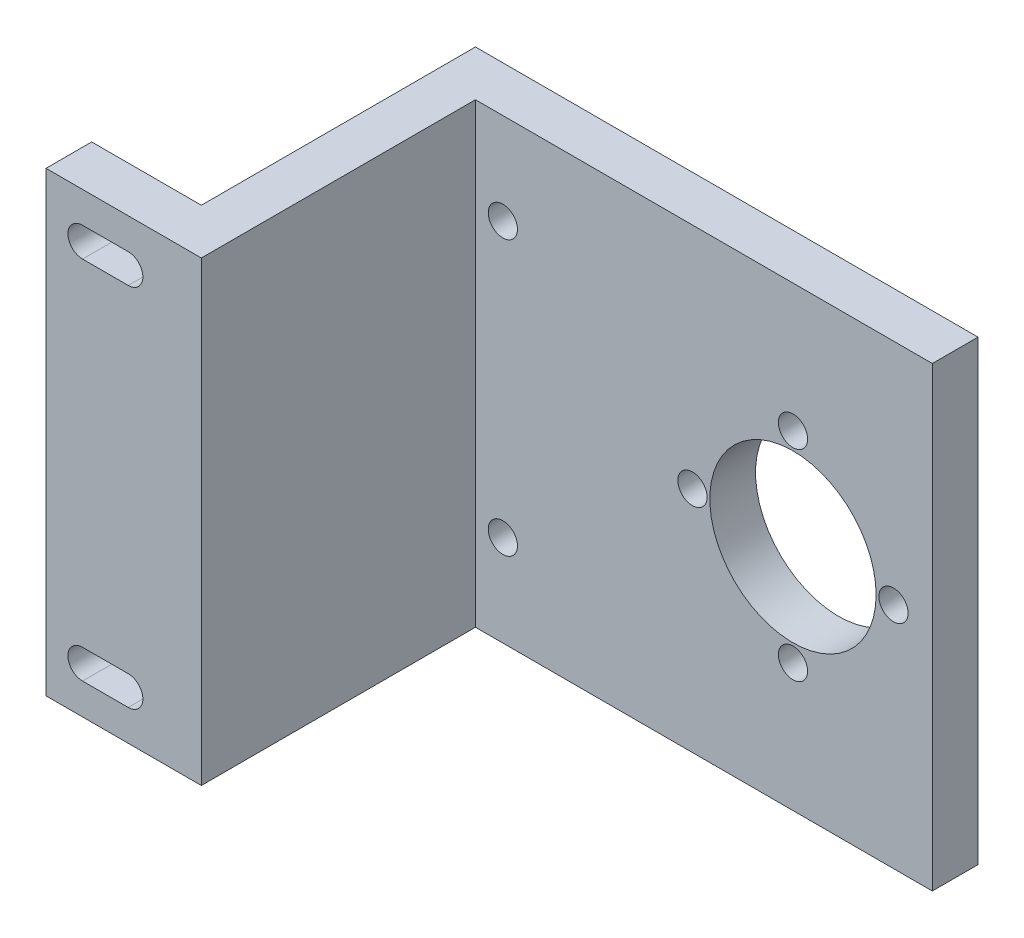
ISO-10303-21;
HEADER;
FILE_DESCRIPTION(('STEP AP214'),'2;1');
FILE_NAME('part.step','',(''),(''),'','','');
FILE_SCHEMA(('AUTOMOTIVE_DESIGN { 1 0 10303 214 1 1 1 1 }'));
ENDSEC;
DATA;
#1=APPLICATION_CONTEXT('core data for automotive mechanical design processes');
#2=APPLICATION_PROTOCOL_DEFINITION('international standard','automotive_design',2000,#1);
#3=PRODUCT_CONTEXT('',#1,'mechanical');
#4=PRODUCT('Part','Part','',(#3));
#5=PRODUCT_RELATED_PRODUCT_CATEGORY('part','',(#4));
#6=PRODUCT_DEFINITION_FORMATION('','',#4);
#7=PRODUCT_DEFINITION_CONTEXT('part definition',#1,'design');
#8=PRODUCT_DEFINITION('design','',#6,#7);
#9=PRODUCT_DEFINITION_SHAPE('','',#8);
#10=(LENGTH_UNIT() NAMED_UNIT(*) SI_UNIT(.MILLI.,.METRE.));
#11=(NAMED_UNIT(*) PLANE_ANGLE_UNIT() SI_UNIT($,.RADIAN.));
#12=(NAMED_UNIT(*) SI_UNIT($,.STERADIAN.) SOLID_ANGLE_UNIT());
#13=UNCERTAINTY_MEASURE_WITH_UNIT(LENGTH_MEASURE(1.E-05),#10,'distance_accuracy_value','');
#14=(GEOMETRIC_REPRESENTATION_CONTEXT(3) GLOBAL_UNCERTAINTY_ASSIGNED_CONTEXT((#13)) GLOBAL_UNIT_ASSIGNED_CONTEXT((#10,
#11,#12)) REPRESENTATION_CONTEXT('',''));
#15=CARTESIAN_POINT('',(0.,0.,0.));
#16=DIRECTION('',(0.,0.,1.));
#17=DIRECTION('',(1.,0.,0.));
#18=AXIS2_PLACEMENT_3D('',#15,#16,#17);
#19=CARTESIAN_POINT('',(0.,50.,0.));
#20=DIRECTION('',(0.,0.,-1.));
#21=DIRECTION('',(-1.,0.,0.));
#22=AXIS2_PLACEMENT_3D('',#19,#20,#21);
#23=PLANE('',#22);
#24=CARTESIAN_POINT('',(50.75,25.,0.));
#25=DIRECTION('',(0.,0.,1.));
#26=DIRECTION('',(1.,0.,0.));
#27=AXIS2_PLACEMENT_3D('',#24,#25,#26);
#28=CIRCLE('',#27,1.6);
#29=CARTESIAN_POINT('',(52.35,25.,0.));
#30=VERTEX_POINT('',#29);
#31=EDGE_CURVE('E274',#30,#30,#28,.T.);
#32=ORIENTED_EDGE('',*,*,#31,.F.);
#33=EDGE_LOOP('',(#32));
#34=FACE_BOUND('',#33,.T.);
#35=CARTESIAN_POINT('',(39.75,36.,0.));
#36=DIRECTION('',(0.,0.,1.));
#37=DIRECTION('',(1.,0.,0.));
#38=AXIS2_PLACEMENT_3D('',#35,#36,#37);
#39=CIRCLE('',#38,1.60000000000001);
#40=CARTESIAN_POINT('',(41.35,36.,0.));
#41=VERTEX_POINT('',#40);
#42=EDGE_CURVE('E287',#41,#41,#39,.T.);
#43=ORIENTED_EDGE('',*,*,#42,.F.);
#44=EDGE_LOOP('',(#43));
#45=FACE_BOUND('',#44,.T.);
#46=CARTESIAN_POINT('',(39.75,25.,0.));
#47=DIRECTION('',(0.,0.,1.));
#48=DIRECTION('',(1.,0.,0.));
#49=AXIS2_PLACEMENT_3D('',#46,#47,#48);
#50=CIRCLE('',#49,9.1);
#51=CARTESIAN_POINT('',(48.85,25.,0.));
#52=VERTEX_POINT('',#51);
#53=EDGE_CURVE('E286',#52,#52,#50,.T.);
#54=ORIENTED_EDGE('',*,*,#53,.F.);
#55=EDGE_LOOP('',(#54));
#56=FACE_BOUND('',#55,.T.);
#57=CARTESIAN_POINT('',(8.,10.,0.));
#58=DIRECTION('',(0.,0.,1.));
#59=DIRECTION('',(1.,0.,0.));
#60=AXIS2_PLACEMENT_3D('',#57,#58,#59);
#61=CIRCLE('',#60,1.6);
#62=CARTESIAN_POINT('',(9.6,10.,0.));
#63=VERTEX_POINT('',#62);
#64=EDGE_CURVE('E297',#63,#63,#61,.T.);
#65=ORIENTED_EDGE('',*,*,#64,.F.);
#66=EDGE_LOOP('',(#65));
#67=FACE_BOUND('',#66,.T.);
#68=CARTESIAN_POINT('',(39.75,14.,0.));
#69=DIRECTION('',(0.,0.,1.));
#70=DIRECTION('',(1.,0.,0.));
#71=AXIS2_PLACEMENT_3D('',#68,#69,#70);
#72=CIRCLE('',#71,1.6);
#73=CARTESIAN_POINT('',(41.35,14.,0.));
#74=VERTEX_POINT('',#73);
#75=EDGE_CURVE('E275',#74,#74,#72,.T.);
#76=ORIENTED_EDGE('',*,*,#75,.F.);
#77=EDGE_LOOP('',(#76));
#78=FACE_BOUND('',#77,.T.);
#79=CARTESIAN_POINT('',(28.75,25.,0.));
#80=DIRECTION('',(0.,0.,1.));
#81=DIRECTION('',(1.,0.,0.));
#82=AXIS2_PLACEMENT_3D('',#79,#80,#81);
#83=CIRCLE('',#82,1.6);
#84=CARTESIAN_POINT('',(30.35,25.,0.));
#85=VERTEX_POINT('',#84);
#86=EDGE_CURVE('E262',#85,#85,#83,.T.);
#87=ORIENTED_EDGE('',*,*,#86,.F.);
#88=EDGE_LOOP('',(#87));
#89=FACE_BOUND('',#88,.T.);
#90=CARTESIAN_POINT('',(8.,40.,0.));
#91=DIRECTION('',(0.,0.,1.));
#92=DIRECTION('',(1.,0.,0.));
#93=AXIS2_PLACEMENT_3D('',#90,#91,#92);
#94=CIRCLE('',#93,1.6);
#95=CARTESIAN_POINT('',(9.6,40.,0.));
#96=VERTEX_POINT('',#95);
#97=EDGE_CURVE('E267',#96,#96,#94,.T.);
#98=ORIENTED_EDGE('',*,*,#97,.F.);
#99=EDGE_LOOP('',(#98));
#100=FACE_BOUND('',#99,.T.);
#101=DIRECTION('',(0.,1.,0.));
#102=VECTOR('',#101,1.);
#103=CARTESIAN_POINT('',(5.,50.,0.));
#104=LINE('',#103,#102);
#105=CARTESIAN_POINT('',(5.,0.,0.));
#106=VERTEX_POINT('',#105);
#107=CARTESIAN_POINT('',(5.,50.,0.));
#108=VERTEX_POINT('',#107);
#109=EDGE_CURVE('E251',#106,#108,#104,.T.);
#110=ORIENTED_EDGE('',*,*,#109,.F.);
#111=DIRECTION('',(1.,0.,0.));
#112=VECTOR('',#111,1.);
#113=CARTESIAN_POINT('',(0.,0.,0.));
#114=LINE('',#113,#112);
#115=CARTESIAN_POINT('',(55.,0.,0.));
#116=VERTEX_POINT('',#115);
#117=EDGE_CURVE('E266',#106,#116,#114,.T.);
#118=ORIENTED_EDGE('',*,*,#117,.T.);
#119=DIRECTION('',(0.,-1.,0.));
#120=VECTOR('',#119,1.);
#121=CARTESIAN_POINT('',(55.,50.,0.));
#122=LINE('',#121,#120);
#123=CARTESIAN_POINT('',(55.,50.,0.));
#124=VERTEX_POINT('',#123);
#125=EDGE_CURVE('E11',#124,#116,#122,.T.);
#126=ORIENTED_EDGE('',*,*,#125,.F.);
#127=DIRECTION('',(1.,0.,0.));
#128=VECTOR('',#127,1.);
#129=CARTESIAN_POINT('',(0.,50.,0.));
#130=LINE('',#129,#128);
#131=EDGE_CURVE('E78',#108,#124,#130,.T.);
#132=ORIENTED_EDGE('',*,*,#131,.F.);
#133=EDGE_LOOP('',(#110,#118,#126,#132));
#134=FACE_BOUND('',#133,.T.);
#135=ADVANCED_FACE('F33',(#34,#45,#56,#67,#78,#89,#100,#134),#23,.F.);
#136=CARTESIAN_POINT('',(55.,50.,0.));
#137=DIRECTION('',(-1.,0.,0.));
#138=DIRECTION('',(0.,0.,1.));
#139=AXIS2_PLACEMENT_3D('',#136,#137,#138);
#140=PLANE('',#139);
#141=DIRECTION('',(0.,0.,-1.));
#142=VECTOR('',#141,1.);
#143=CARTESIAN_POINT('',(55.,0.,0.));
#144=LINE('',#143,#142);
#145=CARTESIAN_POINT('',(55.,0.,-5.));
#146=VERTEX_POINT('',#145);
#147=EDGE_CURVE('E314',#116,#146,#144,.T.);
#148=ORIENTED_EDGE('',*,*,#147,.T.);
#149=DIRECTION('',(0.,-1.,0.));
#150=VECTOR('',#149,1.);
#151=CARTESIAN_POINT('',(55.,50.,-5.));
#152=LINE('',#151,#150);
#153=CARTESIAN_POINT('',(55.,50.,-5.));
#154=VERTEX_POINT('',#153);
#155=EDGE_CURVE('E40',#154,#146,#152,.T.);
#156=ORIENTED_EDGE('',*,*,#155,.F.);
#157=DIRECTION('',(0.,0.,-1.));
#158=VECTOR('',#157,1.);
#159=CARTESIAN_POINT('',(55.,50.,0.));
#160=LINE('',#159,#158);
#161=EDGE_CURVE('E306',#124,#154,#160,.T.);
#162=ORIENTED_EDGE('',*,*,#161,.F.);
#163=ORIENTED_EDGE('',*,*,#125,.T.);
#164=EDGE_LOOP('',(#148,#156,#162,#163));
#165=FACE_BOUND('',#164,.T.);
#166=ADVANCED_FACE('F353',(#165),#140,.F.);
#167=CARTESIAN_POINT('',(0.,50.,-5.));
#168=DIRECTION('',(0.,0.,1.));
#169=DIRECTION('',(1.,0.,0.));
#170=AXIS2_PLACEMENT_3D('',#167,#168,#169);
#171=PLANE('',#170);
#172=CARTESIAN_POINT('',(8.,40.,-5.));
#173=DIRECTION('',(0.,0.,1.));
#174=DIRECTION('',(1.,0.,0.));
#175=AXIS2_PLACEMENT_3D('',#172,#173,#174);
#176=CIRCLE('',#175,1.6);
#177=CARTESIAN_POINT('',(9.6,40.,-5.));
#178=VERTEX_POINT('',#177);
#179=EDGE_CURVE('E263',#178,#178,#176,.T.);
#180=ORIENTED_EDGE('',*,*,#179,.T.);
#181=EDGE_LOOP('',(#180));
#182=FACE_BOUND('',#181,.T.);
#183=CARTESIAN_POINT('',(28.75,25.,-5.));
#184=DIRECTION('',(0.,0.,1.));
#185=DIRECTION('',(1.,0.,0.));
#186=AXIS2_PLACEMENT_3D('',#183,#184,#185);
#187=CIRCLE('',#186,1.6);
#188=CARTESIAN_POINT('',(30.35,25.,-5.));
#189=VERTEX_POINT('',#188);
#190=EDGE_CURVE('E278',#189,#189,#187,.T.);
#191=ORIENTED_EDGE('',*,*,#190,.T.);
#192=EDGE_LOOP('',(#191));
#193=FACE_BOUND('',#192,.T.);
#194=CARTESIAN_POINT('',(39.75,14.,-5.));
#195=DIRECTION('',(0.,0.,1.));
#196=DIRECTION('',(1.,0.,0.));
#197=AXIS2_PLACEMENT_3D('',#194,#195,#196);
#198=CIRCLE('',#197,1.6);
#199=CARTESIAN_POINT('',(41.35,14.,-5.));
#200=VERTEX_POINT('',#199);
#201=EDGE_CURVE('E271',#200,#200,#198,.T.);
#202=ORIENTED_EDGE('',*,*,#201,.T.);
#203=EDGE_LOOP('',(#202));
#204=FACE_BOUND('',#203,.T.);
#205=CARTESIAN_POINT('',(8.,10.,-5.));
#206=DIRECTION('',(0.,0.,1.));
#207=DIRECTION('',(1.,0.,0.));
#208=AXIS2_PLACEMENT_3D('',#205,#206,#207);
#209=CIRCLE('',#208,1.6);
#210=CARTESIAN_POINT('',(9.6,10.,-5.));
#211=VERTEX_POINT('',#210);
#212=EDGE_CURVE('E270',#211,#211,#209,.T.);
#213=ORIENTED_EDGE('',*,*,#212,.T.);
#214=EDGE_LOOP('',(#213));
#215=FACE_BOUND('',#214,.T.);
#216=CARTESIAN_POINT('',(39.75,25.,-5.));
#217=DIRECTION('',(0.,0.,1.));
#218=DIRECTION('',(1.,0.,0.));
#219=AXIS2_PLACEMENT_3D('',#216,#217,#218);
#220=CIRCLE('',#219,9.1);
#221=CARTESIAN_POINT('',(48.85,25.,-5.));
#222=VERTEX_POINT('',#221);
#223=EDGE_CURVE('E300',#222,#222,#220,.T.);
#224=ORIENTED_EDGE('',*,*,#223,.T.);
#225=EDGE_LOOP('',(#224));
#226=FACE_BOUND('',#225,.T.);
#227=CARTESIAN_POINT('',(39.75,36.,-5.));
#228=DIRECTION('',(0.,0.,1.));
#229=DIRECTION('',(1.,0.,0.));
#230=AXIS2_PLACEMENT_3D('',#227,#228,#229);
#231=CIRCLE('',#230,1.60000000000001);
#232=CARTESIAN_POINT('',(41.35,36.,-5.));
#233=VERTEX_POINT('',#232);
#234=EDGE_CURVE('E283',#233,#233,#231,.T.);
#235=ORIENTED_EDGE('',*,*,#234,.T.);
#236=EDGE_LOOP('',(#235));
#237=FACE_BOUND('',#236,.T.);
#238=CARTESIAN_POINT('',(50.75,25.,-5.));
#239=DIRECTION('',(0.,0.,1.));
#240=DIRECTION('',(1.,0.,0.));
#241=AXIS2_PLACEMENT_3D('',#238,#239,#240);
#242=CIRCLE('',#241,1.6);
#243=CARTESIAN_POINT('',(52.35,25.,-5.));
#244=VERTEX_POINT('',#243);
#245=EDGE_CURVE('E290',#244,#244,#242,.T.);
#246=ORIENTED_EDGE('',*,*,#245,.T.);
#247=EDGE_LOOP('',(#246));
#248=FACE_BOUND('',#247,.T.);
#249=DIRECTION('',(-1.,0.,0.));
#250=VECTOR('',#249,1.);
#251=CARTESIAN_POINT('',(0.,0.,-5.));
#252=LINE('',#251,#250);
#253=CARTESIAN_POINT('',(0.,0.,-5.));
#254=VERTEX_POINT('',#253);
#255=EDGE_CURVE('E73',#146,#254,#252,.T.);
#256=ORIENTED_EDGE('',*,*,#255,.T.);
#257=DIRECTION('',(0.,-1.,0.));
#258=VECTOR('',#257,1.);
#259=CARTESIAN_POINT('',(0.,50.,-5.));
#260=LINE('',#259,#258);
#261=CARTESIAN_POINT('',(0.,50.,-5.));
#262=VERTEX_POINT('',#261);
#263=EDGE_CURVE('E312',#262,#254,#260,.T.);
#264=ORIENTED_EDGE('',*,*,#263,.F.);
#265=DIRECTION('',(-1.,0.,0.));
#266=VECTOR('',#265,1.);
#267=CARTESIAN_POINT('',(0.,50.,-5.));
#268=LINE('',#267,#266);
#269=EDGE_CURVE('E56',#154,#262,#268,.T.);
#270=ORIENTED_EDGE('',*,*,#269,.F.);
#271=ORIENTED_EDGE('',*,*,#155,.T.);
#272=EDGE_LOOP('',(#256,#264,#270,#271));
#273=FACE_BOUND('',#272,.T.);
#274=ADVANCED_FACE('F320',(#182,#193,#204,#215,#226,#237,#248,#273),#171,.F.);
#275=CARTESIAN_POINT('',(0.,50.,-5.));
#276=DIRECTION('',(1.,0.,0.));
#277=DIRECTION('',(0.,0.,-1.));
#278=AXIS2_PLACEMENT_3D('',#275,#276,#277);
#279=PLANE('',#278);
#280=DIRECTION('',(0.,0.,1.));
#281=VECTOR('',#280,1.);
#282=CARTESIAN_POINT('',(0.,0.,-5.));
#283=LINE('',#282,#281);
#284=CARTESIAN_POINT('',(0.,0.,25.));
#285=VERTEX_POINT('',#284);
#286=EDGE_CURVE('E307',#254,#285,#283,.T.);
#287=ORIENTED_EDGE('',*,*,#286,.T.);
#288=DIRECTION('',(0.,1.,0.));
#289=VECTOR('',#288,1.);
#290=CARTESIAN_POINT('',(0.,50.,25.));
#291=LINE('',#290,#289);
#292=CARTESIAN_POINT('',(0.,50.,25.));
#293=VERTEX_POINT('',#292);
#294=EDGE_CURVE('E246',#285,#293,#291,.T.);
#295=ORIENTED_EDGE('',*,*,#294,.T.);
#296=DIRECTION('',(0.,0.,1.));
#297=VECTOR('',#296,1.);
#298=CARTESIAN_POINT('',(0.,50.,-5.));
#299=LINE('',#298,#297);
#300=EDGE_CURVE('E310',#262,#293,#299,.T.);
#301=ORIENTED_EDGE('',*,*,#300,.F.);
#302=ORIENTED_EDGE('',*,*,#263,.T.);
#303=EDGE_LOOP('',(#287,#295,#301,#302));
#304=FACE_BOUND('',#303,.T.);
#305=ADVANCED_FACE('F329',(#304),#279,.F.);
#306=CARTESIAN_POINT('',(0.,50.,0.));
#307=DIRECTION('',(0.,1.,0.));
#308=DIRECTION('',(0.,0.,1.));
#309=AXIS2_PLACEMENT_3D('',#306,#307,#308);
#310=PLANE('',#309);
#311=ORIENTED_EDGE('',*,*,#300,.T.);
#312=DIRECTION('',(-1.,0.,0.));
#313=VECTOR('',#312,1.);
#314=CARTESIAN_POINT('',(5.,50.,25.));
#315=LINE('',#314,#313);
#316=CARTESIAN_POINT('',(-12.,50.,25.));
#317=VERTEX_POINT('',#316);
#318=EDGE_CURVE('E232',#293,#317,#315,.T.);
#319=ORIENTED_EDGE('',*,*,#318,.T.);
#320=DIRECTION('',(0.,0.,1.));
#321=VECTOR('',#320,1.);
#322=CARTESIAN_POINT('',(-12.,50.,25.));
#323=LINE('',#322,#321);
#324=CARTESIAN_POINT('',(-12.,50.,30.));
#325=VERTEX_POINT('',#324);
#326=EDGE_CURVE('E240',#317,#325,#323,.T.);
#327=ORIENTED_EDGE('',*,*,#326,.T.);
#328=DIRECTION('',(-1.,0.,0.));
#329=VECTOR('',#328,1.);
#330=CARTESIAN_POINT('',(0.,50.,30.));
#331=LINE('',#330,#329);
#332=CARTESIAN_POINT('',(5.,50.,30.));
#333=VERTEX_POINT('',#332);
#334=EDGE_CURVE('E256',#333,#325,#331,.T.);
#335=ORIENTED_EDGE('',*,*,#334,.F.);
#336=DIRECTION('',(0.,0.,-1.));
#337=VECTOR('',#336,1.);
#338=CARTESIAN_POINT('',(5.,50.,30.));
#339=LINE('',#338,#337);
#340=EDGE_CURVE('E258',#333,#108,#339,.T.);
#341=ORIENTED_EDGE('',*,*,#340,.T.);
#342=ORIENTED_EDGE('',*,*,#131,.T.);
#343=ORIENTED_EDGE('',*,*,#161,.T.);
#344=ORIENTED_EDGE('',*,*,#269,.T.);
#345=EDGE_LOOP('',(#311,#319,#327,#335,#341,#342,#343,#344));
#346=FACE_BOUND('',#345,.T.);
#347=ADVANCED_FACE('F331',(#346),#310,.T.);
#348=CARTESIAN_POINT('',(0.,0.,0.));
#349=DIRECTION('',(0.,1.,0.));
#350=DIRECTION('',(0.,0.,1.));
#351=AXIS2_PLACEMENT_3D('',#348,#349,#350);
#352=PLANE('',#351);
#353=ORIENTED_EDGE('',*,*,#117,.F.);
#354=DIRECTION('',(0.,0.,-1.));
#355=VECTOR('',#354,1.);
#356=CARTESIAN_POINT('',(5.00000000000001,0.,30.));
#357=LINE('',#356,#355);
#358=CARTESIAN_POINT('',(5.00000000000001,0.,30.));
#359=VERTEX_POINT('',#358);
#360=EDGE_CURVE('E47',#359,#106,#357,.T.);
#361=ORIENTED_EDGE('',*,*,#360,.F.);
#362=DIRECTION('',(1.,0.,0.));
#363=VECTOR('',#362,1.);
#364=CARTESIAN_POINT('',(0.,0.,30.));
#365=LINE('',#364,#363);
#366=CARTESIAN_POINT('',(-12.,0.,30.));
#367=VERTEX_POINT('',#366);
#368=EDGE_CURVE('E252',#367,#359,#365,.T.);
#369=ORIENTED_EDGE('',*,*,#368,.F.);
#370=DIRECTION('',(0.,0.,1.));
#371=VECTOR('',#370,1.);
#372=CARTESIAN_POINT('',(-12.,0.,25.));
#373=LINE('',#372,#371);
#374=CARTESIAN_POINT('',(-12.,0.,25.));
#375=VERTEX_POINT('',#374);
#376=EDGE_CURVE('E243',#375,#367,#373,.T.);
#377=ORIENTED_EDGE('',*,*,#376,.F.);
#378=DIRECTION('',(1.,0.,0.));
#379=VECTOR('',#378,1.);
#380=CARTESIAN_POINT('',(5.,0.,25.));
#381=LINE('',#380,#379);
#382=EDGE_CURVE('E237',#375,#285,#381,.T.);
#383=ORIENTED_EDGE('',*,*,#382,.T.);
#384=ORIENTED_EDGE('',*,*,#286,.F.);
#385=ORIENTED_EDGE('',*,*,#255,.F.);
#386=ORIENTED_EDGE('',*,*,#147,.F.);
#387=EDGE_LOOP('',(#353,#361,#369,#377,#383,#384,#385,#386));
#388=FACE_BOUND('',#387,.T.);
#389=ADVANCED_FACE('F326',(#388),#352,.F.);
#390=CARTESIAN_POINT('',(50.75,25.,-5.));
#391=DIRECTION('',(0.,0.,1.));
#392=DIRECTION('',(1.,0.,0.));
#393=AXIS2_PLACEMENT_3D('',#390,#391,#392);
#394=CYLINDRICAL_SURFACE('',#393,1.6);
#395=ORIENTED_EDGE('',*,*,#245,.F.);
#396=EDGE_LOOP('',(#395));
#397=FACE_BOUND('',#396,.T.);
#398=ORIENTED_EDGE('',*,*,#31,.T.);
#399=EDGE_LOOP('',(#398));
#400=FACE_BOUND('',#399,.T.);
#401=ADVANCED_FACE('F487',(#397,#400),#394,.F.);
#402=CARTESIAN_POINT('',(39.75,36.,-5.));
#403=DIRECTION('',(0.,0.,1.));
#404=DIRECTION('',(1.,0.,0.));
#405=AXIS2_PLACEMENT_3D('',#402,#403,#404);
#406=CYLINDRICAL_SURFACE('',#405,1.60000000000001);
#407=ORIENTED_EDGE('',*,*,#234,.F.);
#408=EDGE_LOOP('',(#407));
#409=FACE_BOUND('',#408,.T.);
#410=ORIENTED_EDGE('',*,*,#42,.T.);
#411=EDGE_LOOP('',(#410));
#412=FACE_BOUND('',#411,.T.);
#413=ADVANCED_FACE('F565',(#409,#412),#406,.F.);
#414=CARTESIAN_POINT('',(39.75,25.,-5.));
#415=DIRECTION('',(0.,0.,1.));
#416=DIRECTION('',(1.,0.,0.));
#417=AXIS2_PLACEMENT_3D('',#414,#415,#416);
#418=CYLINDRICAL_SURFACE('',#417,9.1);
#419=ORIENTED_EDGE('',*,*,#223,.F.);
#420=EDGE_LOOP('',(#419));
#421=FACE_BOUND('',#420,.T.);
#422=ORIENTED_EDGE('',*,*,#53,.T.);
#423=EDGE_LOOP('',(#422));
#424=FACE_BOUND('',#423,.T.);
#425=ADVANCED_FACE('F555',(#421,#424),#418,.F.);
#426=CARTESIAN_POINT('',(8.,10.,-5.));
#427=DIRECTION('',(0.,0.,1.));
#428=DIRECTION('',(1.,0.,0.));
#429=AXIS2_PLACEMENT_3D('',#426,#427,#428);
#430=CYLINDRICAL_SURFACE('',#429,1.6);
#431=ORIENTED_EDGE('',*,*,#212,.F.);
#432=EDGE_LOOP('',(#431));
#433=FACE_BOUND('',#432,.T.);
#434=ORIENTED_EDGE('',*,*,#64,.T.);
#435=EDGE_LOOP('',(#434));
#436=FACE_BOUND('',#435,.T.);
#437=ADVANCED_FACE('F545',(#433,#436),#430,.F.);
#438=CARTESIAN_POINT('',(39.75,14.,-5.));
#439=DIRECTION('',(0.,0.,1.));
#440=DIRECTION('',(1.,0.,0.));
#441=AXIS2_PLACEMENT_3D('',#438,#439,#440);
#442=CYLINDRICAL_SURFACE('',#441,1.6);
#443=ORIENTED_EDGE('',*,*,#201,.F.);
#444=EDGE_LOOP('',(#443));
#445=FACE_BOUND('',#444,.T.);
#446=ORIENTED_EDGE('',*,*,#75,.T.);
#447=EDGE_LOOP('',(#446));
#448=FACE_BOUND('',#447,.T.);
#449=ADVANCED_FACE('F535',(#445,#448),#442,.F.);
#450=CARTESIAN_POINT('',(28.75,25.,-5.));
#451=DIRECTION('',(0.,0.,1.));
#452=DIRECTION('',(1.,0.,0.));
#453=AXIS2_PLACEMENT_3D('',#450,#451,#452);
#454=CYLINDRICAL_SURFACE('',#453,1.6);
#455=ORIENTED_EDGE('',*,*,#190,.F.);
#456=EDGE_LOOP('',(#455));
#457=FACE_BOUND('',#456,.T.);
#458=ORIENTED_EDGE('',*,*,#86,.T.);
#459=EDGE_LOOP('',(#458));
#460=FACE_BOUND('',#459,.T.);
#461=ADVANCED_FACE('F524',(#457,#460),#454,.F.);
#462=CARTESIAN_POINT('',(8.,40.,-5.));
#463=DIRECTION('',(0.,0.,1.));
#464=DIRECTION('',(1.,0.,0.));
#465=AXIS2_PLACEMENT_3D('',#462,#463,#464);
#466=CYLINDRICAL_SURFACE('',#465,1.6);
#467=ORIENTED_EDGE('',*,*,#179,.F.);
#468=EDGE_LOOP('',(#467));
#469=FACE_BOUND('',#468,.T.);
#470=ORIENTED_EDGE('',*,*,#97,.T.);
#471=EDGE_LOOP('',(#470));
#472=FACE_BOUND('',#471,.T.);
#473=ADVANCED_FACE('F520',(#469,#472),#466,.F.);
#474=CARTESIAN_POINT('',(5.,50.,30.));
#475=DIRECTION('',(-1.,0.,0.));
#476=DIRECTION('',(0.,-1.,0.));
#477=AXIS2_PLACEMENT_3D('',#474,#475,#476);
#478=PLANE('',#477);
#479=ORIENTED_EDGE('',*,*,#109,.T.);
#480=ORIENTED_EDGE('',*,*,#340,.F.);
#481=DIRECTION('',(0.,1.,0.));
#482=VECTOR('',#481,1.);
#483=CARTESIAN_POINT('',(5.,50.,30.));
#484=LINE('',#483,#482);
#485=EDGE_CURVE('E254',#359,#333,#484,.T.);
#486=ORIENTED_EDGE('',*,*,#485,.F.);
#487=ORIENTED_EDGE('',*,*,#360,.T.);
#488=EDGE_LOOP('',(#479,#480,#486,#487));
#489=FACE_BOUND('',#488,.T.);
#490=ADVANCED_FACE('F348',(#489),#478,.F.);
#491=CARTESIAN_POINT('',(0.,0.,30.));
#492=DIRECTION('',(0.,0.,1.));
#493=DIRECTION('',(1.,0.,0.));
#494=AXIS2_PLACEMENT_3D('',#491,#492,#493);
#495=PLANE('',#494);
#496=ORIENTED_EDGE('',*,*,#334,.T.);
#497=DIRECTION('',(0.,-1.,0.));
#498=VECTOR('',#497,1.);
#499=CARTESIAN_POINT('',(-12.,50.,30.));
#500=LINE('',#499,#498);
#501=EDGE_CURVE('E225',#325,#367,#500,.T.);
#502=ORIENTED_EDGE('',*,*,#501,.T.);
#503=ORIENTED_EDGE('',*,*,#368,.T.);
#504=ORIENTED_EDGE('',*,*,#485,.T.);
#505=EDGE_LOOP('',(#496,#502,#503,#504));
#506=FACE_BOUND('',#505,.T.);
#507=DIRECTION('',(1.,0.,0.));
#508=VECTOR('',#507,1.);
#509=CARTESIAN_POINT('',(-8.00000000000001,3.4,30.));
#510=LINE('',#509,#508);
#511=CARTESIAN_POINT('',(-8.00000000000001,3.4,30.));
#512=VERTEX_POINT('',#511);
#513=CARTESIAN_POINT('',(-3.00000000000001,3.4,30.));
#514=VERTEX_POINT('',#513);
#515=EDGE_CURVE('E190',#512,#514,#510,.T.);
#516=ORIENTED_EDGE('',*,*,#515,.F.);
#517=CARTESIAN_POINT('',(-8.00000000000001,5.,30.));
#518=DIRECTION('',(0.,0.,1.));
#519=DIRECTION('',(-1.,0.,0.));
#520=AXIS2_PLACEMENT_3D('',#517,#518,#519);
#521=CIRCLE('',#520,1.6);
#522=CARTESIAN_POINT('',(-8.00000000000001,6.59999999999999,30.));
#523=VERTEX_POINT('',#522);
#524=EDGE_CURVE('E163',#523,#512,#521,.T.);
#525=ORIENTED_EDGE('',*,*,#524,.F.);
#526=DIRECTION('',(-1.,0.,0.));
#527=VECTOR('',#526,1.);
#528=CARTESIAN_POINT('',(-8.00000000000001,6.59999999999999,30.));
#529=LINE('',#528,#527);
#530=CARTESIAN_POINT('',(-3.00000000000001,6.59999999999999,30.));
#531=VERTEX_POINT('',#530);
#532=EDGE_CURVE('E181',#531,#523,#529,.T.);
#533=ORIENTED_EDGE('',*,*,#532,.F.);
#534=CARTESIAN_POINT('',(-3.00000000000001,5.,30.));
#535=DIRECTION('',(0.,0.,1.));
#536=DIRECTION('',(-1.,0.,0.));
#537=AXIS2_PLACEMENT_3D('',#534,#535,#536);
#538=CIRCLE('',#537,1.6);
#539=EDGE_CURVE('E184',#514,#531,#538,.T.);
#540=ORIENTED_EDGE('',*,*,#539,.F.);
#541=EDGE_LOOP('',(#516,#525,#533,#540));
#542=FACE_BOUND('',#541,.T.);
#543=DIRECTION('',(1.,0.,0.));
#544=VECTOR('',#543,1.);
#545=CARTESIAN_POINT('',(-8.00000000000001,43.4,30.));
#546=LINE('',#545,#544);
#547=CARTESIAN_POINT('',(-8.00000000000001,43.4,30.));
#548=VERTEX_POINT('',#547);
#549=CARTESIAN_POINT('',(-3.00000000000001,43.4,30.));
#550=VERTEX_POINT('',#549);
#551=EDGE_CURVE('E215',#548,#550,#546,.T.);
#552=ORIENTED_EDGE('',*,*,#551,.F.);
#553=CARTESIAN_POINT('',(-8.00000000000001,45.,30.));
#554=DIRECTION('',(0.,0.,1.));
#555=DIRECTION('',(1.,0.,0.));
#556=AXIS2_PLACEMENT_3D('',#553,#554,#555);
#557=CIRCLE('',#556,1.6);
#558=CARTESIAN_POINT('',(-8.00000000000001,46.6,30.));
#559=VERTEX_POINT('',#558);
#560=EDGE_CURVE('E196',#559,#548,#557,.T.);
#561=ORIENTED_EDGE('',*,*,#560,.F.);
#562=DIRECTION('',(-1.,0.,0.));
#563=VECTOR('',#562,1.);
#564=CARTESIAN_POINT('',(-8.00000000000001,46.6,30.));
#565=LINE('',#564,#563);
#566=CARTESIAN_POINT('',(-3.00000000000001,46.6,30.));
#567=VERTEX_POINT('',#566);
#568=EDGE_CURVE('E204',#567,#559,#565,.T.);
#569=ORIENTED_EDGE('',*,*,#568,.F.);
#570=CARTESIAN_POINT('',(-3.00000000000001,45.,30.));
#571=DIRECTION('',(0.,0.,1.));
#572=DIRECTION('',(1.,0.,0.));
#573=AXIS2_PLACEMENT_3D('',#570,#571,#572);
#574=CIRCLE('',#573,1.6);
#575=EDGE_CURVE('E218',#550,#567,#574,.T.);
#576=ORIENTED_EDGE('',*,*,#575,.F.);
#577=EDGE_LOOP('',(#552,#561,#569,#576));
#578=FACE_BOUND('',#577,.T.);
#579=ADVANCED_FACE('F339',(#506,#542,#578),#495,.T.);
#580=CARTESIAN_POINT('',(0.,0.,25.));
#581=DIRECTION('',(0.,0.,-1.));
#582=DIRECTION('',(-1.,0.,0.));
#583=AXIS2_PLACEMENT_3D('',#580,#581,#582);
#584=PLANE('',#583);
#585=CARTESIAN_POINT('',(-8.00000000000001,45.,25.));
#586=DIRECTION('',(0.,0.,1.));
#587=DIRECTION('',(1.,0.,0.));
#588=AXIS2_PLACEMENT_3D('',#585,#586,#587);
#589=CIRCLE('',#588,1.6);
#590=CARTESIAN_POINT('',(-8.00000000000001,46.6,25.));
#591=VERTEX_POINT('',#590);
#592=CARTESIAN_POINT('',(-8.00000000000001,43.4,25.));
#593=VERTEX_POINT('',#592);
#594=EDGE_CURVE('E200',#591,#593,#589,.T.);
#595=ORIENTED_EDGE('',*,*,#594,.T.);
#596=DIRECTION('',(1.,0.,0.));
#597=VECTOR('',#596,1.);
#598=CARTESIAN_POINT('',(-8.00000000000001,43.4,25.));
#599=LINE('',#598,#597);
#600=CARTESIAN_POINT('',(-3.00000000000001,43.4,25.));
#601=VERTEX_POINT('',#600);
#602=EDGE_CURVE('E203',#593,#601,#599,.T.);
#603=ORIENTED_EDGE('',*,*,#602,.T.);
#604=CARTESIAN_POINT('',(-3.00000000000001,45.,25.));
#605=DIRECTION('',(0.,0.,1.));
#606=DIRECTION('',(1.,0.,0.));
#607=AXIS2_PLACEMENT_3D('',#604,#605,#606);
#608=CIRCLE('',#607,1.6);
#609=CARTESIAN_POINT('',(-3.00000000000001,46.6,25.));
#610=VERTEX_POINT('',#609);
#611=EDGE_CURVE('E207',#601,#610,#608,.T.);
#612=ORIENTED_EDGE('',*,*,#611,.T.);
#613=DIRECTION('',(-1.,0.,0.));
#614=VECTOR('',#613,1.);
#615=CARTESIAN_POINT('',(-8.00000000000001,46.6,25.));
#616=LINE('',#615,#614);
#617=EDGE_CURVE('E210',#610,#591,#616,.T.);
#618=ORIENTED_EDGE('',*,*,#617,.T.);
#619=EDGE_LOOP('',(#595,#603,#612,#618));
#620=FACE_BOUND('',#619,.T.);
#621=CARTESIAN_POINT('',(-8.00000000000001,5.,25.));
#622=DIRECTION('',(0.,0.,1.));
#623=DIRECTION('',(-1.,0.,0.));
#624=AXIS2_PLACEMENT_3D('',#621,#622,#623);
#625=CIRCLE('',#624,1.6);
#626=CARTESIAN_POINT('',(-8.00000000000001,6.59999999999999,25.));
#627=VERTEX_POINT('',#626);
#628=CARTESIAN_POINT('',(-8.00000000000001,3.4,25.));
#629=VERTEX_POINT('',#628);
#630=EDGE_CURVE('E160',#627,#629,#625,.T.);
#631=ORIENTED_EDGE('',*,*,#630,.T.);
#632=DIRECTION('',(1.,0.,0.));
#633=VECTOR('',#632,1.);
#634=CARTESIAN_POINT('',(-8.00000000000001,3.4,25.));
#635=LINE('',#634,#633);
#636=CARTESIAN_POINT('',(-3.00000000000001,3.4,25.));
#637=VERTEX_POINT('',#636);
#638=EDGE_CURVE('E172',#629,#637,#635,.T.);
#639=ORIENTED_EDGE('',*,*,#638,.T.);
#640=CARTESIAN_POINT('',(-3.00000000000001,5.,25.));
#641=DIRECTION('',(0.,0.,1.));
#642=DIRECTION('',(-1.,0.,0.));
#643=AXIS2_PLACEMENT_3D('',#640,#641,#642);
#644=CIRCLE('',#643,1.6);
#645=CARTESIAN_POINT('',(-3.00000000000001,6.59999999999999,25.));
#646=VERTEX_POINT('',#645);
#647=EDGE_CURVE('E176',#637,#646,#644,.T.);
#648=ORIENTED_EDGE('',*,*,#647,.T.);
#649=DIRECTION('',(-1.,0.,0.));
#650=VECTOR('',#649,1.);
#651=CARTESIAN_POINT('',(-8.00000000000001,6.59999999999999,25.));
#652=LINE('',#651,#650);
#653=EDGE_CURVE('E168',#646,#627,#652,.T.);
#654=ORIENTED_EDGE('',*,*,#653,.T.);
#655=EDGE_LOOP('',(#631,#639,#648,#654));
#656=FACE_BOUND('',#655,.T.);
#657=ORIENTED_EDGE('',*,*,#294,.F.);
#658=ORIENTED_EDGE('',*,*,#382,.F.);
#659=DIRECTION('',(0.,-1.,0.));
#660=VECTOR('',#659,1.);
#661=CARTESIAN_POINT('',(-12.,50.,25.));
#662=LINE('',#661,#660);
#663=EDGE_CURVE('E234',#317,#375,#662,.T.);
#664=ORIENTED_EDGE('',*,*,#663,.F.);
#665=ORIENTED_EDGE('',*,*,#318,.F.);
#666=EDGE_LOOP('',(#657,#658,#664,#665));
#667=FACE_BOUND('',#666,.T.);
#668=ADVANCED_FACE('F178',(#620,#656,#667),#584,.T.);
#669=CARTESIAN_POINT('',(-12.,50.,25.));
#670=DIRECTION('',(-1.,0.,0.));
#671=DIRECTION('',(0.,0.,1.));
#672=AXIS2_PLACEMENT_3D('',#669,#670,#671);
#673=PLANE('',#672);
#674=ORIENTED_EDGE('',*,*,#501,.F.);
#675=ORIENTED_EDGE('',*,*,#326,.F.);
#676=ORIENTED_EDGE('',*,*,#663,.T.);
#677=ORIENTED_EDGE('',*,*,#376,.T.);
#678=EDGE_LOOP('',(#674,#675,#676,#677));
#679=FACE_BOUND('',#678,.T.);
#680=ADVANCED_FACE('F337',(#679),#673,.T.);
#681=CARTESIAN_POINT('',(-8.00000000000001,45.,25.));
#682=DIRECTION('',(0.,0.,1.));
#683=DIRECTION('',(1.,0.,0.));
#684=AXIS2_PLACEMENT_3D('',#681,#682,#683);
#685=CYLINDRICAL_SURFACE('',#684,1.6);
#686=ORIENTED_EDGE('',*,*,#560,.T.);
#687=DIRECTION('',(0.,0.,1.));
#688=VECTOR('',#687,1.);
#689=CARTESIAN_POINT('',(-8.00000000000001,43.4,25.));
#690=LINE('',#689,#688);
#691=EDGE_CURVE('E213',#593,#548,#690,.T.);
#692=ORIENTED_EDGE('',*,*,#691,.F.);
#693=ORIENTED_EDGE('',*,*,#594,.F.);
#694=DIRECTION('',(0.,0.,1.));
#695=VECTOR('',#694,1.);
#696=CARTESIAN_POINT('',(-8.00000000000001,46.6,25.));
#697=LINE('',#696,#695);
#698=EDGE_CURVE('E223',#591,#559,#697,.T.);
#699=ORIENTED_EDGE('',*,*,#698,.T.);
#700=EDGE_LOOP('',(#686,#692,#693,#699));
#701=FACE_BOUND('',#700,.T.);
#702=ADVANCED_FACE('F346',(#701),#685,.F.);
#703=CARTESIAN_POINT('',(-8.00000000000001,46.6,25.));
#704=DIRECTION('',(0.,1.,0.));
#705=DIRECTION('',(0.,0.,1.));
#706=AXIS2_PLACEMENT_3D('',#703,#704,#705);
#707=PLANE('',#706);
#708=ORIENTED_EDGE('',*,*,#568,.T.);
#709=ORIENTED_EDGE('',*,*,#698,.F.);
#710=ORIENTED_EDGE('',*,*,#617,.F.);
#711=DIRECTION('',(0.,0.,1.));
#712=VECTOR('',#711,1.);
#713=CARTESIAN_POINT('',(-3.00000000000001,46.6,25.));
#714=LINE('',#713,#712);
#715=EDGE_CURVE('E226',#610,#567,#714,.T.);
#716=ORIENTED_EDGE('',*,*,#715,.T.);
#717=EDGE_LOOP('',(#708,#709,#710,#716));
#718=FACE_BOUND('',#717,.T.);
#719=ADVANCED_FACE('F389',(#718),#707,.F.);
#720=CARTESIAN_POINT('',(-3.00000000000001,45.,25.));
#721=DIRECTION('',(0.,0.,1.));
#722=DIRECTION('',(1.,0.,0.));
#723=AXIS2_PLACEMENT_3D('',#720,#721,#722);
#724=CYLINDRICAL_SURFACE('',#723,1.6);
#725=ORIENTED_EDGE('',*,*,#575,.T.);
#726=ORIENTED_EDGE('',*,*,#715,.F.);
#727=ORIENTED_EDGE('',*,*,#611,.F.);
#728=DIRECTION('',(0.,0.,1.));
#729=VECTOR('',#728,1.);
#730=CARTESIAN_POINT('',(-3.00000000000001,43.4,25.));
#731=LINE('',#730,#729);
#732=EDGE_CURVE('E228',#601,#550,#731,.T.);
#733=ORIENTED_EDGE('',*,*,#732,.T.);
#734=EDGE_LOOP('',(#725,#726,#727,#733));
#735=FACE_BOUND('',#734,.T.);
#736=ADVANCED_FACE('F391',(#735),#724,.F.);
#737=CARTESIAN_POINT('',(-8.00000000000001,43.4,25.));
#738=DIRECTION('',(0.,-1.,0.));
#739=DIRECTION('',(0.,0.,-1.));
#740=AXIS2_PLACEMENT_3D('',#737,#738,#739);
#741=PLANE('',#740);
#742=ORIENTED_EDGE('',*,*,#551,.T.);
#743=ORIENTED_EDGE('',*,*,#732,.F.);
#744=ORIENTED_EDGE('',*,*,#602,.F.);
#745=ORIENTED_EDGE('',*,*,#691,.T.);
#746=EDGE_LOOP('',(#742,#743,#744,#745));
#747=FACE_BOUND('',#746,.T.);
#748=ADVANCED_FACE('F383',(#747),#741,.F.);
#749=CARTESIAN_POINT('',(-8.00000000000001,5.,25.));
#750=DIRECTION('',(0.,0.,1.));
#751=DIRECTION('',(1.,0.,0.));
#752=AXIS2_PLACEMENT_3D('',#749,#750,#751);
#753=CYLINDRICAL_SURFACE('',#752,1.6);
#754=ORIENTED_EDGE('',*,*,#524,.T.);
#755=DIRECTION('',(0.,0.,1.));
#756=VECTOR('',#755,1.);
#757=CARTESIAN_POINT('',(-8.00000000000001,3.4,25.));
#758=LINE('',#757,#756);
#759=EDGE_CURVE('E156',#629,#512,#758,.T.);
#760=ORIENTED_EDGE('',*,*,#759,.F.);
#761=ORIENTED_EDGE('',*,*,#630,.F.);
#762=DIRECTION('',(0.,0.,1.));
#763=VECTOR('',#762,1.);
#764=CARTESIAN_POINT('',(-8.00000000000001,6.59999999999999,25.));
#765=LINE('',#764,#763);
#766=EDGE_CURVE('E194',#627,#523,#765,.T.);
#767=ORIENTED_EDGE('',*,*,#766,.T.);
#768=EDGE_LOOP('',(#754,#760,#761,#767));
#769=FACE_BOUND('',#768,.T.);
#770=ADVANCED_FACE('F158',(#769),#753,.F.);
#771=CARTESIAN_POINT('',(-8.00000000000001,6.59999999999999,25.));
#772=DIRECTION('',(0.,1.,0.));
#773=DIRECTION('',(0.,0.,1.));
#774=AXIS2_PLACEMENT_3D('',#771,#772,#773);
#775=PLANE('',#774);
#776=ORIENTED_EDGE('',*,*,#532,.T.);
#777=ORIENTED_EDGE('',*,*,#766,.F.);
#778=ORIENTED_EDGE('',*,*,#653,.F.);
#779=DIRECTION('',(0.,0.,1.));
#780=VECTOR('',#779,1.);
#781=CARTESIAN_POINT('',(-3.00000000000001,6.59999999999999,25.));
#782=LINE('',#781,#780);
#783=EDGE_CURVE('E197',#646,#531,#782,.T.);
#784=ORIENTED_EDGE('',*,*,#783,.T.);
#785=EDGE_LOOP('',(#776,#777,#778,#784));
#786=FACE_BOUND('',#785,.T.);
#787=ADVANCED_FACE('F429',(#786),#775,.F.);
#788=CARTESIAN_POINT('',(-3.00000000000001,5.,25.));
#789=DIRECTION('',(0.,0.,1.));
#790=DIRECTION('',(1.,0.,0.));
#791=AXIS2_PLACEMENT_3D('',#788,#789,#790);
#792=CYLINDRICAL_SURFACE('',#791,1.6);
#793=ORIENTED_EDGE('',*,*,#539,.T.);
#794=ORIENTED_EDGE('',*,*,#783,.F.);
#795=ORIENTED_EDGE('',*,*,#647,.F.);
#796=DIRECTION('',(0.,0.,1.));
#797=VECTOR('',#796,1.);
#798=CARTESIAN_POINT('',(-3.00000000000001,3.4,25.));
#799=LINE('',#798,#797);
#800=EDGE_CURVE('E167',#637,#514,#799,.T.);
#801=ORIENTED_EDGE('',*,*,#800,.T.);
#802=EDGE_LOOP('',(#793,#794,#795,#801));
#803=FACE_BOUND('',#802,.T.);
#804=ADVANCED_FACE('F437',(#803),#792,.F.);
#805=CARTESIAN_POINT('',(-8.00000000000001,3.4,25.));
#806=DIRECTION('',(0.,-1.,0.));
#807=DIRECTION('',(0.,0.,-1.));
#808=AXIS2_PLACEMENT_3D('',#805,#806,#807);
#809=PLANE('',#808);
#810=ORIENTED_EDGE('',*,*,#515,.T.);
#811=ORIENTED_EDGE('',*,*,#800,.F.);
#812=ORIENTED_EDGE('',*,*,#638,.F.);
#813=ORIENTED_EDGE('',*,*,#759,.T.);
#814=EDGE_LOOP('',(#810,#811,#812,#813));
#815=FACE_BOUND('',#814,.T.);
#816=ADVANCED_FACE('F173',(#815),#809,.F.);
#817=CLOSED_SHELL('',(#135,#166,#274,#305,#347,#389,#401,#413,#425,#437,#449,#461,#473,#490,
#579,#668,#680,#702,#719,#736,#748,#770,#787,#804,#816));
#818=MANIFOLD_SOLID_BREP('B2',#817);
#819=ADVANCED_BREP_SHAPE_REPRESENTATION('',(#18,#818),#14);
#820=SHAPE_DEFINITION_REPRESENTATION(#9,#819);
ENDSEC;
END-ISO-10303-21;
